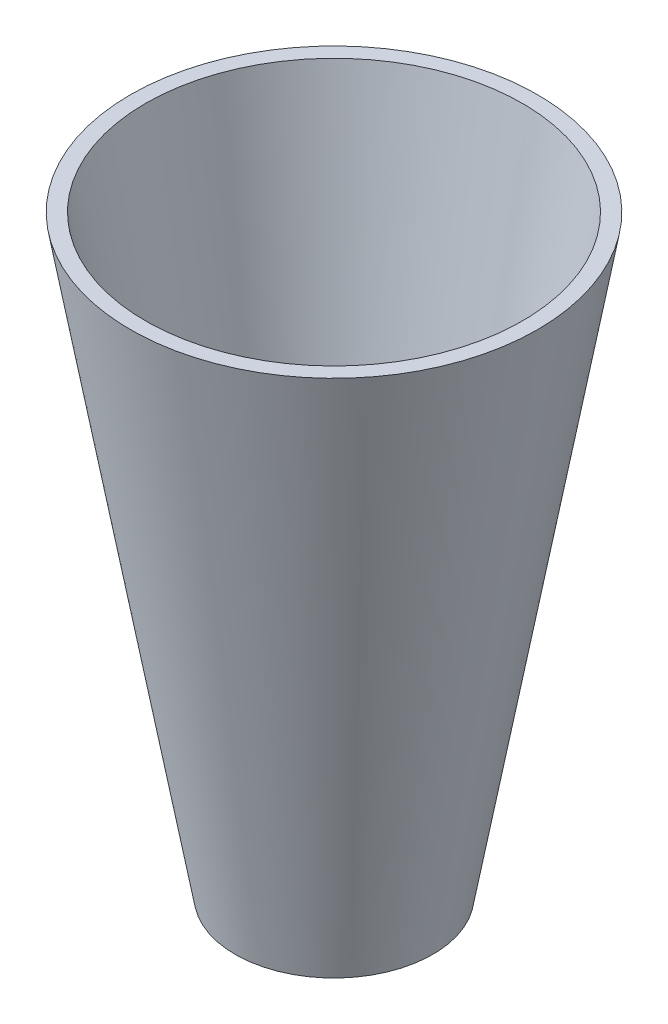
ISO-10303-21;
HEADER;
FILE_DESCRIPTION(('STEP AP214'),'2;1');
FILE_NAME('part.step','',(''),(''),'','','');
FILE_SCHEMA(('AUTOMOTIVE_DESIGN { 1 0 10303 214 1 1 1 1 }'));
ENDSEC;
DATA;
#1=APPLICATION_CONTEXT('core data for automotive mechanical design processes');
#2=APPLICATION_PROTOCOL_DEFINITION('international standard','automotive_design',2000,#1);
#3=PRODUCT_CONTEXT('',#1,'mechanical');
#4=PRODUCT('Part','Part','',(#3));
#5=PRODUCT_RELATED_PRODUCT_CATEGORY('part','',(#4));
#6=PRODUCT_DEFINITION_FORMATION('','',#4);
#7=PRODUCT_DEFINITION_CONTEXT('part definition',#1,'design');
#8=PRODUCT_DEFINITION('design','',#6,#7);
#9=PRODUCT_DEFINITION_SHAPE('','',#8);
#10=(LENGTH_UNIT() NAMED_UNIT(*) SI_UNIT(.MILLI.,.METRE.));
#11=(NAMED_UNIT(*) PLANE_ANGLE_UNIT() SI_UNIT($,.RADIAN.));
#12=(NAMED_UNIT(*) SI_UNIT($,.STERADIAN.) SOLID_ANGLE_UNIT());
#13=UNCERTAINTY_MEASURE_WITH_UNIT(LENGTH_MEASURE(1.E-05),#10,'distance_accuracy_value','');
#14=(GEOMETRIC_REPRESENTATION_CONTEXT(3) GLOBAL_UNCERTAINTY_ASSIGNED_CONTEXT((#13)) GLOBAL_UNIT_ASSIGNED_CONTEXT((#10,
#11,#12)) REPRESENTATION_CONTEXT('',''));
#15=CARTESIAN_POINT('',(0.,0.,0.));
#16=DIRECTION('',(0.,0.,1.));
#17=DIRECTION('',(1.,0.,0.));
#18=AXIS2_PLACEMENT_3D('',#15,#16,#17);
#19=CARTESIAN_POINT('',(0.,0.,0.));
#20=DIRECTION('',(0.,1.,0.));
#21=DIRECTION('',(-1.,0.,0.));
#22=AXIS2_PLACEMENT_3D('',#19,#20,#21);
#23=PLANE('',#22);
#24=CARTESIAN_POINT('',(0.,0.,0.));
#25=DIRECTION('',(0.,1.,0.));
#26=DIRECTION('',(-1.,0.,0.));
#27=AXIS2_PLACEMENT_3D('',#24,#25,#26);
#28=CIRCLE('',#27,10.);
#29=CARTESIAN_POINT('',(-10.,0.,0.));
#30=VERTEX_POINT('',#29);
#31=EDGE_CURVE('E12',#30,#30,#28,.T.);
#32=ORIENTED_EDGE('',*,*,#31,.F.);
#33=EDGE_LOOP('',(#32));
#34=FACE_BOUND('',#33,.T.);
#35=ADVANCED_FACE('F42',(#34),#23,.F.);
#36=CARTESIAN_POINT('',(0.,0.,0.));
#37=DIRECTION('',(0.,1.,0.));
#38=DIRECTION('',(-1.,0.,0.));
#39=AXIS2_PLACEMENT_3D('',#36,#37,#38);
#40=CONICAL_SURFACE('',#39,10.,0.174532925199429);
#41=CARTESIAN_POINT('',(0.,60.,0.));
#42=DIRECTION('',(0.,1.,0.));
#43=DIRECTION('',(-1.,0.,0.));
#44=AXIS2_PLACEMENT_3D('',#41,#42,#43);
#45=CIRCLE('',#44,20.5796188425076);
#46=CARTESIAN_POINT('',(-20.5796188425076,60.,0.));
#47=VERTEX_POINT('',#46);
#48=EDGE_CURVE('E48',#47,#47,#45,.T.);
#49=ORIENTED_EDGE('',*,*,#48,.F.);
#50=EDGE_LOOP('',(#49));
#51=FACE_BOUND('',#50,.T.);
#52=ORIENTED_EDGE('',*,*,#31,.T.);
#53=EDGE_LOOP('',(#52));
#54=FACE_BOUND('',#53,.T.);
#55=ADVANCED_FACE('F72',(#51,#54),#40,.T.);
#56=CARTESIAN_POINT('',(20.5796188425076,60.,0.));
#57=DIRECTION('',(0.,-1.,0.));
#58=DIRECTION('',(1.,0.,0.));
#59=AXIS2_PLACEMENT_3D('',#56,#57,#58);
#60=PLANE('',#59);
#61=CARTESIAN_POINT('',(0.,60.,0.));
#62=DIRECTION('',(0.,1.,0.));
#63=DIRECTION('',(-1.,0.,0.));
#64=AXIS2_PLACEMENT_3D('',#61,#62,#63);
#65=CIRCLE('',#64,19.056478924679);
#66=CARTESIAN_POINT('',(-19.056478924679,60.,0.));
#67=VERTEX_POINT('',#66);
#68=EDGE_CURVE('E52',#67,#67,#65,.T.);
#69=ORIENTED_EDGE('',*,*,#68,.F.);
#70=EDGE_LOOP('',(#69));
#71=FACE_BOUND('',#70,.T.);
#72=ORIENTED_EDGE('',*,*,#48,.T.);
#73=EDGE_LOOP('',(#72));
#74=FACE_BOUND('',#73,.T.);
#75=ADVANCED_FACE('F67',(#71,#74),#60,.F.);
#76=CARTESIAN_POINT('',(0.,60.,0.));
#77=DIRECTION('',(0.,1.,0.));
#78=DIRECTION('',(-1.,0.,0.));
#79=AXIS2_PLACEMENT_3D('',#76,#77,#78);
#80=CONICAL_SURFACE('',#79,19.056478924679,0.174532925199429);
#81=CARTESIAN_POINT('',(0.,1.5,0.));
#82=DIRECTION('',(0.,1.,0.));
#83=DIRECTION('',(-1.,0.,0.));
#84=AXIS2_PLACEMENT_3D('',#81,#82,#83);
#85=CIRCLE('',#84,8.74135055323407);
#86=CARTESIAN_POINT('',(-8.74135055323407,1.5,0.));
#87=VERTEX_POINT('',#86);
#88=EDGE_CURVE('E56',#87,#87,#85,.T.);
#89=ORIENTED_EDGE('',*,*,#88,.F.);
#90=EDGE_LOOP('',(#89));
#91=FACE_BOUND('',#90,.T.);
#92=ORIENTED_EDGE('',*,*,#68,.T.);
#93=EDGE_LOOP('',(#92));
#94=FACE_BOUND('',#93,.T.);
#95=ADVANCED_FACE('F64',(#91,#94),#80,.F.);
#96=CARTESIAN_POINT('',(8.74135055323407,1.5,0.));
#97=DIRECTION('',(0.,-1.,0.));
#98=DIRECTION('',(1.,0.,0.));
#99=AXIS2_PLACEMENT_3D('',#96,#97,#98);
#100=PLANE('',#99);
#101=ORIENTED_EDGE('',*,*,#88,.T.);
#102=EDGE_LOOP('',(#101));
#103=FACE_BOUND('',#102,.T.);
#104=ADVANCED_FACE('F62',(#103),#100,.F.);
#105=CLOSED_SHELL('',(#35,#55,#75,#95,#104));
#106=MANIFOLD_SOLID_BREP('B2',#105);
#107=ADVANCED_BREP_SHAPE_REPRESENTATION('',(#18,#106),#14);
#108=SHAPE_DEFINITION_REPRESENTATION(#9,#107);
ENDSEC;
END-ISO-10303-21;
